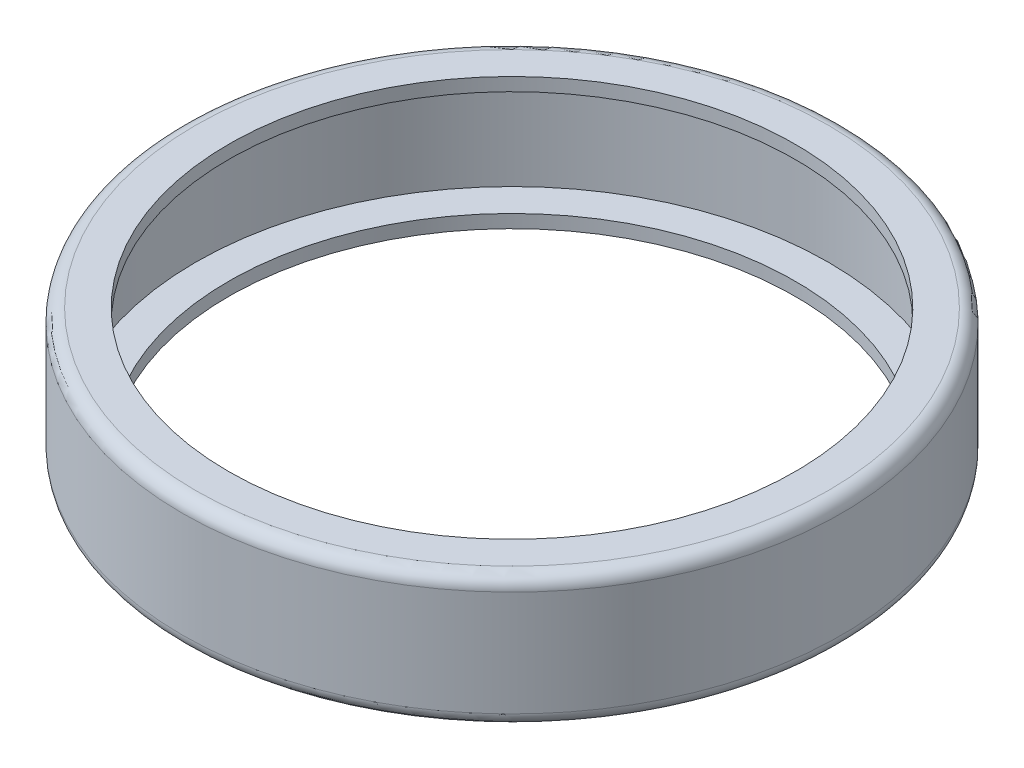
ISO-10303-21;
HEADER;
FILE_DESCRIPTION(('STEP AP214'),'2;1');
FILE_NAME('part.step','',(''),(''),'','','');
FILE_SCHEMA(('AUTOMOTIVE_DESIGN { 1 0 10303 214 1 1 1 1 }'));
ENDSEC;
DATA;
#1=APPLICATION_CONTEXT('core data for automotive mechanical design processes');
#2=APPLICATION_PROTOCOL_DEFINITION('international standard','automotive_design',2000,#1);
#3=PRODUCT_CONTEXT('',#1,'mechanical');
#4=PRODUCT('Part','Part','',(#3));
#5=PRODUCT_RELATED_PRODUCT_CATEGORY('part','',(#4));
#6=PRODUCT_DEFINITION_FORMATION('','',#4);
#7=PRODUCT_DEFINITION_CONTEXT('part definition',#1,'design');
#8=PRODUCT_DEFINITION('design','',#6,#7);
#9=PRODUCT_DEFINITION_SHAPE('','',#8);
#10=(LENGTH_UNIT() NAMED_UNIT(*) SI_UNIT(.MILLI.,.METRE.));
#11=(NAMED_UNIT(*) PLANE_ANGLE_UNIT() SI_UNIT($,.RADIAN.));
#12=(NAMED_UNIT(*) SI_UNIT($,.STERADIAN.) SOLID_ANGLE_UNIT());
#13=UNCERTAINTY_MEASURE_WITH_UNIT(LENGTH_MEASURE(1.E-05),#10,'distance_accuracy_value','');
#14=(GEOMETRIC_REPRESENTATION_CONTEXT(3) GLOBAL_UNCERTAINTY_ASSIGNED_CONTEXT((#13)) GLOBAL_UNIT_ASSIGNED_CONTEXT((#10,
#11,#12)) REPRESENTATION_CONTEXT('',''));
#15=CARTESIAN_POINT('',(0.,0.,0.));
#16=DIRECTION('',(0.,0.,1.));
#17=DIRECTION('',(1.,0.,0.));
#18=AXIS2_PLACEMENT_3D('',#15,#16,#17);
#19=CARTESIAN_POINT('',(0.,25.4,0.));
#20=DIRECTION('',(0.,1.,0.));
#21=DIRECTION('',(0.,0.,1.));
#22=AXIS2_PLACEMENT_3D('',#19,#20,#21);
#23=PLANE('',#22);
#24=CARTESIAN_POINT('',(0.,25.4,0.));
#25=DIRECTION('',(0.,1.,0.));
#26=DIRECTION('',(0.,0.,1.));
#27=AXIS2_PLACEMENT_3D('',#24,#25,#26);
#28=CIRCLE('',#27,60.96);
#29=CARTESIAN_POINT('',(0.,25.4,60.96));
#30=VERTEX_POINT('',#29);
#31=EDGE_CURVE('E10',#30,#30,#28,.T.);
#32=ORIENTED_EDGE('',*,*,#31,.T.);
#33=EDGE_LOOP('',(#32));
#34=FACE_BOUND('',#33,.T.);
#35=CARTESIAN_POINT('',(0.,25.4,0.));
#36=DIRECTION('',(0.,1.,0.));
#37=DIRECTION('',(0.,0.,1.));
#38=AXIS2_PLACEMENT_3D('',#35,#36,#37);
#39=CIRCLE('',#38,54.61);
#40=CARTESIAN_POINT('',(0.,25.4,54.61));
#41=VERTEX_POINT('',#40);
#42=EDGE_CURVE('E72',#41,#41,#39,.T.);
#43=ORIENTED_EDGE('',*,*,#42,.F.);
#44=EDGE_LOOP('',(#43));
#45=FACE_BOUND('',#44,.T.);
#46=ADVANCED_FACE('F37',(#34,#45),#23,.T.);
#47=CARTESIAN_POINT('',(0.,17.709250119598,0.));
#48=DIRECTION('',(0.,1.,0.));
#49=DIRECTION('',(0.,0.,1.));
#50=AXIS2_PLACEMENT_3D('',#47,#48,#49);
#51=CYLINDRICAL_SURFACE('',#50,63.5);
#52=CARTESIAN_POINT('',(0.,2.54,0.));
#53=DIRECTION('',(0.,-1.,0.));
#54=DIRECTION('',(0.,0.,-1.));
#55=AXIS2_PLACEMENT_3D('',#52,#53,#54);
#56=CIRCLE('',#55,63.5);
#57=CARTESIAN_POINT('',(0.,2.54,-63.5));
#58=VERTEX_POINT('',#57);
#59=EDGE_CURVE('E48',#58,#58,#56,.F.);
#60=ORIENTED_EDGE('',*,*,#59,.T.);
#61=EDGE_LOOP('',(#60));
#62=FACE_BOUND('',#61,.T.);
#63=CARTESIAN_POINT('',(0.,22.86,0.));
#64=DIRECTION('',(0.,1.,0.));
#65=DIRECTION('',(0.,0.,1.));
#66=AXIS2_PLACEMENT_3D('',#63,#64,#65);
#67=CIRCLE('',#66,63.5);
#68=CARTESIAN_POINT('',(0.,22.86,63.5));
#69=VERTEX_POINT('',#68);
#70=EDGE_CURVE('E52',#69,#69,#67,.F.);
#71=ORIENTED_EDGE('',*,*,#70,.T.);
#72=EDGE_LOOP('',(#71));
#73=FACE_BOUND('',#72,.T.);
#74=ADVANCED_FACE('F80',(#62,#73),#51,.T.);
#75=CARTESIAN_POINT('',(0.,0.,0.));
#76=DIRECTION('',(0.,-1.,0.));
#77=DIRECTION('',(0.,0.,-1.));
#78=AXIS2_PLACEMENT_3D('',#75,#76,#77);
#79=PLANE('',#78);
#80=CARTESIAN_POINT('',(0.,0.,0.));
#81=DIRECTION('',(0.,-1.,0.));
#82=DIRECTION('',(0.,0.,-1.));
#83=AXIS2_PLACEMENT_3D('',#80,#81,#82);
#84=CIRCLE('',#83,60.96);
#85=CARTESIAN_POINT('',(0.,0.,-60.96));
#86=VERTEX_POINT('',#85);
#87=EDGE_CURVE('E44',#86,#86,#84,.T.);
#88=ORIENTED_EDGE('',*,*,#87,.T.);
#89=EDGE_LOOP('',(#88));
#90=FACE_BOUND('',#89,.T.);
#91=CARTESIAN_POINT('',(0.,0.,0.));
#92=DIRECTION('',(0.,1.,0.));
#93=DIRECTION('',(0.,0.,1.));
#94=AXIS2_PLACEMENT_3D('',#91,#92,#93);
#95=CIRCLE('',#94,54.61);
#96=CARTESIAN_POINT('',(0.,0.,54.61));
#97=VERTEX_POINT('',#96);
#98=EDGE_CURVE('E57',#97,#97,#95,.T.);
#99=ORIENTED_EDGE('',*,*,#98,.T.);
#100=EDGE_LOOP('',(#99));
#101=FACE_BOUND('',#100,.T.);
#102=ADVANCED_FACE('F85',(#90,#101),#79,.T.);
#103=CARTESIAN_POINT('',(0.,17.709250119598,0.));
#104=DIRECTION('',(0.,1.,0.));
#105=DIRECTION('',(0.,0.,1.));
#106=AXIS2_PLACEMENT_3D('',#103,#104,#105);
#107=CYLINDRICAL_SURFACE('',#106,54.61);
#108=CARTESIAN_POINT('',(0.,2.54,0.));
#109=DIRECTION('',(0.,1.,0.));
#110=DIRECTION('',(0.,0.,1.));
#111=AXIS2_PLACEMENT_3D('',#108,#109,#110);
#112=CIRCLE('',#111,54.61);
#113=CARTESIAN_POINT('',(0.,2.54,54.61));
#114=VERTEX_POINT('',#113);
#115=EDGE_CURVE('E60',#114,#114,#112,.T.);
#116=ORIENTED_EDGE('',*,*,#115,.T.);
#117=EDGE_LOOP('',(#116));
#118=FACE_BOUND('',#117,.T.);
#119=ORIENTED_EDGE('',*,*,#98,.F.);
#120=EDGE_LOOP('',(#119));
#121=FACE_BOUND('',#120,.T.);
#122=ADVANCED_FACE('F117',(#118,#121),#107,.F.);
#123=CARTESIAN_POINT('',(0.,2.54,0.));
#124=DIRECTION('',(0.,1.,0.));
#125=DIRECTION('',(0.,0.,1.));
#126=AXIS2_PLACEMENT_3D('',#123,#124,#125);
#127=PLANE('',#126);
#128=CARTESIAN_POINT('',(0.,2.54,0.));
#129=DIRECTION('',(0.,1.,0.));
#130=DIRECTION('',(0.,0.,1.));
#131=AXIS2_PLACEMENT_3D('',#128,#129,#130);
#132=CIRCLE('',#131,60.96);
#133=CARTESIAN_POINT('',(0.,2.54,60.96));
#134=VERTEX_POINT('',#133);
#135=EDGE_CURVE('E63',#134,#134,#132,.T.);
#136=ORIENTED_EDGE('',*,*,#135,.T.);
#137=EDGE_LOOP('',(#136));
#138=FACE_BOUND('',#137,.T.);
#139=ORIENTED_EDGE('',*,*,#115,.F.);
#140=EDGE_LOOP('',(#139));
#141=FACE_BOUND('',#140,.T.);
#142=ADVANCED_FACE('F113',(#138,#141),#127,.T.);
#143=CARTESIAN_POINT('',(0.,17.709250119598,0.));
#144=DIRECTION('',(0.,1.,0.));
#145=DIRECTION('',(0.,0.,1.));
#146=AXIS2_PLACEMENT_3D('',#143,#144,#145);
#147=CYLINDRICAL_SURFACE('',#146,60.96);
#148=CARTESIAN_POINT('',(0.,22.86,0.));
#149=DIRECTION('',(0.,1.,0.));
#150=DIRECTION('',(0.,0.,1.));
#151=AXIS2_PLACEMENT_3D('',#148,#149,#150);
#152=CIRCLE('',#151,60.96);
#153=CARTESIAN_POINT('',(0.,22.86,60.96));
#154=VERTEX_POINT('',#153);
#155=EDGE_CURVE('E66',#154,#154,#152,.T.);
#156=ORIENTED_EDGE('',*,*,#155,.T.);
#157=EDGE_LOOP('',(#156));
#158=FACE_BOUND('',#157,.T.);
#159=ORIENTED_EDGE('',*,*,#135,.F.);
#160=EDGE_LOOP('',(#159));
#161=FACE_BOUND('',#160,.T.);
#162=ADVANCED_FACE('F107',(#158,#161),#147,.F.);
#163=CARTESIAN_POINT('',(0.,22.86,0.));
#164=DIRECTION('',(0.,-1.,0.));
#165=DIRECTION('',(0.,0.,-1.));
#166=AXIS2_PLACEMENT_3D('',#163,#164,#165);
#167=PLANE('',#166);
#168=CARTESIAN_POINT('',(0.,22.86,0.));
#169=DIRECTION('',(0.,1.,0.));
#170=DIRECTION('',(0.,0.,1.));
#171=AXIS2_PLACEMENT_3D('',#168,#169,#170);
#172=CIRCLE('',#171,54.61);
#173=CARTESIAN_POINT('',(0.,22.86,54.61));
#174=VERTEX_POINT('',#173);
#175=EDGE_CURVE('E69',#174,#174,#172,.T.);
#176=ORIENTED_EDGE('',*,*,#175,.T.);
#177=EDGE_LOOP('',(#176));
#178=FACE_BOUND('',#177,.T.);
#179=ORIENTED_EDGE('',*,*,#155,.F.);
#180=EDGE_LOOP('',(#179));
#181=FACE_BOUND('',#180,.T.);
#182=ADVANCED_FACE('F97',(#178,#181),#167,.T.);
#183=CARTESIAN_POINT('',(0.,17.709250119598,0.));
#184=DIRECTION('',(0.,1.,0.));
#185=DIRECTION('',(0.,0.,1.));
#186=AXIS2_PLACEMENT_3D('',#183,#184,#185);
#187=CYLINDRICAL_SURFACE('',#186,54.61);
#188=ORIENTED_EDGE('',*,*,#42,.T.);
#189=EDGE_LOOP('',(#188));
#190=FACE_BOUND('',#189,.T.);
#191=ORIENTED_EDGE('',*,*,#175,.F.);
#192=EDGE_LOOP('',(#191));
#193=FACE_BOUND('',#192,.T.);
#194=ADVANCED_FACE('F76',(#190,#193),#187,.F.);
#195=CARTESIAN_POINT('',(0.,2.54,0.));
#196=DIRECTION('',(0.,-1.,0.));
#197=DIRECTION('',(0.,0.,-1.));
#198=AXIS2_PLACEMENT_3D('',#195,#196,#197);
#199=TOROIDAL_SURFACE('',#198,60.96,2.54);
#200=ORIENTED_EDGE('',*,*,#87,.F.);
#201=EDGE_LOOP('',(#200));
#202=FACE_BOUND('',#201,.T.);
#203=ORIENTED_EDGE('',*,*,#59,.F.);
#204=EDGE_LOOP('',(#203));
#205=FACE_BOUND('',#204,.T.);
#206=ADVANCED_FACE('F89',(#202,#205),#199,.T.);
#207=CARTESIAN_POINT('',(0.,22.86,0.));
#208=DIRECTION('',(0.,1.,0.));
#209=DIRECTION('',(0.,0.,1.));
#210=AXIS2_PLACEMENT_3D('',#207,#208,#209);
#211=TOROIDAL_SURFACE('',#210,60.96,2.54);
#212=ORIENTED_EDGE('',*,*,#70,.F.);
#213=EDGE_LOOP('',(#212));
#214=FACE_BOUND('',#213,.T.);
#215=ORIENTED_EDGE('',*,*,#31,.F.);
#216=EDGE_LOOP('',(#215));
#217=FACE_BOUND('',#216,.T.);
#218=ADVANCED_FACE('F39',(#214,#217),#211,.T.);
#219=CLOSED_SHELL('',(#46,#74,#102,#122,#142,#162,#182,#194,#206,#218));
#220=MANIFOLD_SOLID_BREP('B2',#219);
#221=ADVANCED_BREP_SHAPE_REPRESENTATION('',(#18,#220),#14);
#222=SHAPE_DEFINITION_REPRESENTATION(#9,#221);
ENDSEC;
END-ISO-10303-21;
